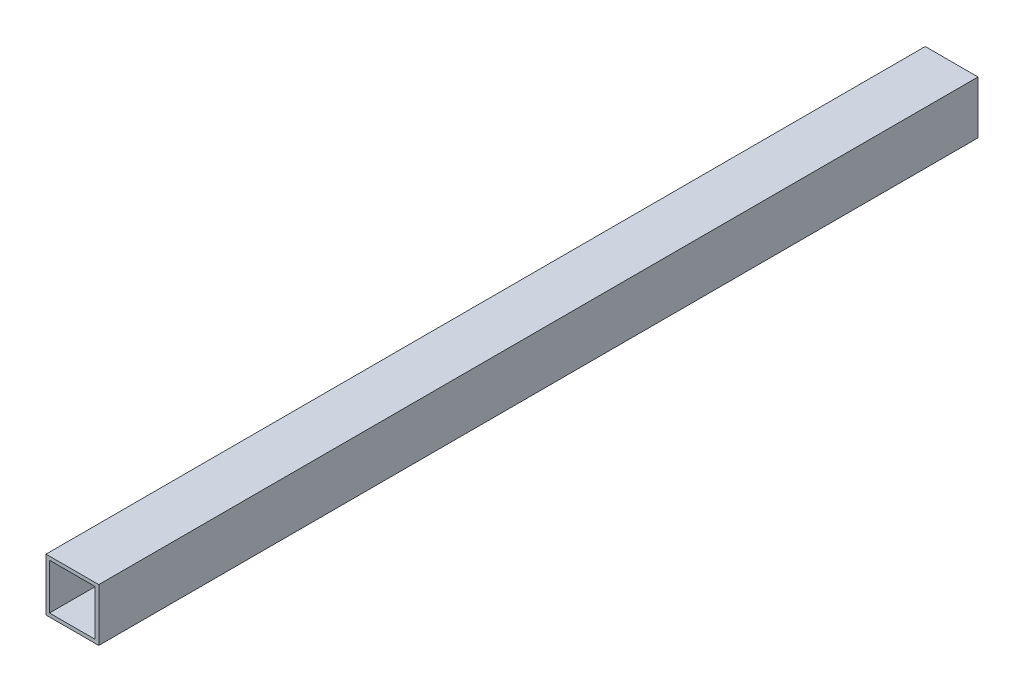
ISO-10303-21;
HEADER;
FILE_DESCRIPTION(('STEP AP214'),'2;1');
FILE_NAME('part.step','',(''),(''),'','','');
FILE_SCHEMA(('AUTOMOTIVE_DESIGN { 1 0 10303 214 1 1 1 1 }'));
ENDSEC;
DATA;
#1=APPLICATION_CONTEXT('core data for automotive mechanical design processes');
#2=APPLICATION_PROTOCOL_DEFINITION('international standard','automotive_design',2000,#1);
#3=PRODUCT_CONTEXT('',#1,'mechanical');
#4=PRODUCT('Part','Part','',(#3));
#5=PRODUCT_RELATED_PRODUCT_CATEGORY('part','',(#4));
#6=PRODUCT_DEFINITION_FORMATION('','',#4);
#7=PRODUCT_DEFINITION_CONTEXT('part definition',#1,'design');
#8=PRODUCT_DEFINITION('design','',#6,#7);
#9=PRODUCT_DEFINITION_SHAPE('','',#8);
#10=(LENGTH_UNIT() NAMED_UNIT(*) SI_UNIT(.MILLI.,.METRE.));
#11=(NAMED_UNIT(*) PLANE_ANGLE_UNIT() SI_UNIT($,.RADIAN.));
#12=(NAMED_UNIT(*) SI_UNIT($,.STERADIAN.) SOLID_ANGLE_UNIT());
#13=UNCERTAINTY_MEASURE_WITH_UNIT(LENGTH_MEASURE(1.E-05),#10,'distance_accuracy_value','');
#14=(GEOMETRIC_REPRESENTATION_CONTEXT(3) GLOBAL_UNCERTAINTY_ASSIGNED_CONTEXT((#13)) GLOBAL_UNIT_ASSIGNED_CONTEXT((#10,
#11,#12)) REPRESENTATION_CONTEXT('',''));
#15=CARTESIAN_POINT('',(0.,0.,0.));
#16=DIRECTION('',(0.,0.,1.));
#17=DIRECTION('',(1.,0.,0.));
#18=AXIS2_PLACEMENT_3D('',#15,#16,#17);
#19=CARTESIAN_POINT('',(-94.2052139280012,59.6622468790826,500.));
#20=DIRECTION('',(1.,0.,0.));
#21=DIRECTION('',(0.,0.,-1.));
#22=AXIS2_PLACEMENT_3D('',#19,#20,#21);
#23=PLANE('',#22);
#24=DIRECTION('',(0.,-1.,0.));
#25=VECTOR('',#24,1.);
#26=CARTESIAN_POINT('',(-94.2052139280012,59.6622468790826,0.));
#27=LINE('',#26,#25);
#28=CARTESIAN_POINT('',(-94.2052139280012,59.6622468790826,0.));
#29=VERTEX_POINT('',#28);
#30=CARTESIAN_POINT('',(-94.2052139280012,29.6622468790826,0.));
#31=VERTEX_POINT('',#30);
#32=EDGE_CURVE('E143',#29,#31,#27,.T.);
#33=ORIENTED_EDGE('',*,*,#32,.T.);
#34=DIRECTION('',(0.,0.,-1.));
#35=VECTOR('',#34,1.);
#36=CARTESIAN_POINT('',(-94.2052139280012,29.6622468790826,500.));
#37=LINE('',#36,#35);
#38=CARTESIAN_POINT('',(-94.2052139280012,29.6622468790826,500.));
#39=VERTEX_POINT('',#38);
#40=EDGE_CURVE('E11',#39,#31,#37,.T.);
#41=ORIENTED_EDGE('',*,*,#40,.F.);
#42=DIRECTION('',(0.,-1.,0.));
#43=VECTOR('',#42,1.);
#44=CARTESIAN_POINT('',(-94.2052139280012,59.6622468790826,500.));
#45=LINE('',#44,#43);
#46=CARTESIAN_POINT('',(-94.2052139280012,59.6622468790826,500.));
#47=VERTEX_POINT('',#46);
#48=EDGE_CURVE('E132',#47,#39,#45,.T.);
#49=ORIENTED_EDGE('',*,*,#48,.F.);
#50=DIRECTION('',(0.,0.,-1.));
#51=VECTOR('',#50,1.);
#52=CARTESIAN_POINT('',(-94.2052139280012,59.6622468790826,500.));
#53=LINE('',#52,#51);
#54=EDGE_CURVE('E142',#47,#29,#53,.T.);
#55=ORIENTED_EDGE('',*,*,#54,.T.);
#56=EDGE_LOOP('',(#33,#41,#49,#55));
#57=FACE_BOUND('',#56,.T.);
#58=ADVANCED_FACE('F35',(#57),#23,.F.);
#59=CARTESIAN_POINT('',(-94.2052139280012,29.6622468790826,500.));
#60=DIRECTION('',(0.,1.,0.));
#61=DIRECTION('',(0.,0.,1.));
#62=AXIS2_PLACEMENT_3D('',#59,#60,#61);
#63=PLANE('',#62);
#64=DIRECTION('',(1.,0.,0.));
#65=VECTOR('',#64,1.);
#66=CARTESIAN_POINT('',(-94.2052139280012,29.6622468790826,0.));
#67=LINE('',#66,#65);
#68=CARTESIAN_POINT('',(-64.2052139280012,29.6622468790826,0.));
#69=VERTEX_POINT('',#68);
#70=EDGE_CURVE('E146',#31,#69,#67,.T.);
#71=ORIENTED_EDGE('',*,*,#70,.T.);
#72=DIRECTION('',(0.,0.,-1.));
#73=VECTOR('',#72,1.);
#74=CARTESIAN_POINT('',(-64.2052139280012,29.6622468790826,500.));
#75=LINE('',#74,#73);
#76=CARTESIAN_POINT('',(-64.2052139280012,29.6622468790826,500.));
#77=VERTEX_POINT('',#76);
#78=EDGE_CURVE('E42',#77,#69,#75,.T.);
#79=ORIENTED_EDGE('',*,*,#78,.F.);
#80=DIRECTION('',(1.,0.,0.));
#81=VECTOR('',#80,1.);
#82=CARTESIAN_POINT('',(-94.2052139280012,29.6622468790826,500.));
#83=LINE('',#82,#81);
#84=EDGE_CURVE('E135',#39,#77,#83,.T.);
#85=ORIENTED_EDGE('',*,*,#84,.F.);
#86=ORIENTED_EDGE('',*,*,#40,.T.);
#87=EDGE_LOOP('',(#71,#79,#85,#86));
#88=FACE_BOUND('',#87,.T.);
#89=ADVANCED_FACE('F174',(#88),#63,.F.);
#90=CARTESIAN_POINT('',(-64.2052139280012,59.6622468790826,500.));
#91=DIRECTION('',(-1.,0.,0.));
#92=DIRECTION('',(0.,0.,1.));
#93=AXIS2_PLACEMENT_3D('',#90,#91,#92);
#94=PLANE('',#93);
#95=DIRECTION('',(0.,1.,0.));
#96=VECTOR('',#95,1.);
#97=CARTESIAN_POINT('',(-64.2052139280012,59.6622468790826,0.));
#98=LINE('',#97,#96);
#99=CARTESIAN_POINT('',(-64.2052139280012,59.6622468790826,0.));
#100=VERTEX_POINT('',#99);
#101=EDGE_CURVE('E148',#69,#100,#98,.T.);
#102=ORIENTED_EDGE('',*,*,#101,.T.);
#103=DIRECTION('',(0.,0.,-1.));
#104=VECTOR('',#103,1.);
#105=CARTESIAN_POINT('',(-64.2052139280012,59.6622468790826,500.));
#106=LINE('',#105,#104);
#107=CARTESIAN_POINT('',(-64.2052139280012,59.6622468790826,500.));
#108=VERTEX_POINT('',#107);
#109=EDGE_CURVE('E153',#108,#100,#106,.T.);
#110=ORIENTED_EDGE('',*,*,#109,.F.);
#111=DIRECTION('',(0.,1.,0.));
#112=VECTOR('',#111,1.);
#113=CARTESIAN_POINT('',(-64.2052139280012,59.6622468790826,500.));
#114=LINE('',#113,#112);
#115=EDGE_CURVE('E138',#77,#108,#114,.T.);
#116=ORIENTED_EDGE('',*,*,#115,.F.);
#117=ORIENTED_EDGE('',*,*,#78,.T.);
#118=EDGE_LOOP('',(#102,#110,#116,#117));
#119=FACE_BOUND('',#118,.T.);
#120=ADVANCED_FACE('F160',(#119),#94,.F.);
#121=CARTESIAN_POINT('',(-94.2052139280012,59.6622468790826,500.));
#122=DIRECTION('',(0.,-1.,0.));
#123=DIRECTION('',(0.,0.,-1.));
#124=AXIS2_PLACEMENT_3D('',#121,#122,#123);
#125=PLANE('',#124);
#126=DIRECTION('',(-1.,0.,0.));
#127=VECTOR('',#126,1.);
#128=CARTESIAN_POINT('',(-94.2052139280012,59.6622468790826,0.));
#129=LINE('',#128,#127);
#130=EDGE_CURVE('E136',#100,#29,#129,.T.);
#131=ORIENTED_EDGE('',*,*,#130,.T.);
#132=ORIENTED_EDGE('',*,*,#54,.F.);
#133=DIRECTION('',(-1.,0.,0.));
#134=VECTOR('',#133,1.);
#135=CARTESIAN_POINT('',(-94.2052139280012,59.6622468790826,500.));
#136=LINE('',#135,#134);
#137=EDGE_CURVE('E140',#108,#47,#136,.T.);
#138=ORIENTED_EDGE('',*,*,#137,.F.);
#139=ORIENTED_EDGE('',*,*,#109,.T.);
#140=EDGE_LOOP('',(#131,#132,#138,#139));
#141=FACE_BOUND('',#140,.T.);
#142=ADVANCED_FACE('F167',(#141),#125,.F.);
#143=CARTESIAN_POINT('',(0.,0.,500.));
#144=DIRECTION('',(0.,0.,1.));
#145=DIRECTION('',(1.,0.,0.));
#146=AXIS2_PLACEMENT_3D('',#143,#144,#145);
#147=PLANE('',#146);
#148=DIRECTION('',(0.,-1.,0.));
#149=VECTOR('',#148,1.);
#150=CARTESIAN_POINT('',(-92.2052139280012,59.6622468790826,500.));
#151=LINE('',#150,#149);
#152=CARTESIAN_POINT('',(-92.2052139280012,57.6622468790826,500.));
#153=VERTEX_POINT('',#152);
#154=CARTESIAN_POINT('',(-92.2052139280012,31.6622468790826,500.));
#155=VERTEX_POINT('',#154);
#156=EDGE_CURVE('E120',#153,#155,#151,.T.);
#157=ORIENTED_EDGE('',*,*,#156,.F.);
#158=DIRECTION('',(-1.,0.,0.));
#159=VECTOR('',#158,1.);
#160=CARTESIAN_POINT('',(-94.2052139280012,57.6622468790826,500.));
#161=LINE('',#160,#159);
#162=CARTESIAN_POINT('',(-66.2052139280012,57.6622468790826,500.));
#163=VERTEX_POINT('',#162);
#164=EDGE_CURVE('E104',#163,#153,#161,.T.);
#165=ORIENTED_EDGE('',*,*,#164,.F.);
#166=DIRECTION('',(0.,1.,0.));
#167=VECTOR('',#166,1.);
#168=CARTESIAN_POINT('',(-66.2052139280012,59.6622468790826,500.));
#169=LINE('',#168,#167);
#170=CARTESIAN_POINT('',(-66.2052139280012,31.6622468790826,500.));
#171=VERTEX_POINT('',#170);
#172=EDGE_CURVE('E129',#171,#163,#169,.T.);
#173=ORIENTED_EDGE('',*,*,#172,.F.);
#174=DIRECTION('',(1.,0.,0.));
#175=VECTOR('',#174,1.);
#176=CARTESIAN_POINT('',(-94.2052139280012,31.6622468790826,500.));
#177=LINE('',#176,#175);
#178=EDGE_CURVE('E122',#155,#171,#177,.T.);
#179=ORIENTED_EDGE('',*,*,#178,.F.);
#180=EDGE_LOOP('',(#157,#165,#173,#179));
#181=FACE_BOUND('',#180,.T.);
#182=ORIENTED_EDGE('',*,*,#48,.T.);
#183=ORIENTED_EDGE('',*,*,#84,.T.);
#184=ORIENTED_EDGE('',*,*,#115,.T.);
#185=ORIENTED_EDGE('',*,*,#137,.T.);
#186=EDGE_LOOP('',(#182,#183,#184,#185));
#187=FACE_BOUND('',#186,.T.);
#188=ADVANCED_FACE('F173',(#181,#187),#147,.T.);
#189=CARTESIAN_POINT('',(0.,0.,0.));
#190=DIRECTION('',(0.,0.,1.));
#191=DIRECTION('',(1.,0.,0.));
#192=AXIS2_PLACEMENT_3D('',#189,#190,#191);
#193=PLANE('',#192);
#194=DIRECTION('',(-1.,0.,0.));
#195=VECTOR('',#194,1.);
#196=CARTESIAN_POINT('',(-94.2052139280012,57.6622468790826,0.));
#197=LINE('',#196,#195);
#198=CARTESIAN_POINT('',(-66.2052139280012,57.6622468790826,0.));
#199=VERTEX_POINT('',#198);
#200=CARTESIAN_POINT('',(-92.2052139280012,57.6622468790826,0.));
#201=VERTEX_POINT('',#200);
#202=EDGE_CURVE('E102',#199,#201,#197,.T.);
#203=ORIENTED_EDGE('',*,*,#202,.T.);
#204=DIRECTION('',(0.,-1.,0.));
#205=VECTOR('',#204,1.);
#206=CARTESIAN_POINT('',(-92.2052139280012,59.6622468790826,0.));
#207=LINE('',#206,#205);
#208=CARTESIAN_POINT('',(-92.2052139280012,31.6622468790826,0.));
#209=VERTEX_POINT('',#208);
#210=EDGE_CURVE('E110',#201,#209,#207,.T.);
#211=ORIENTED_EDGE('',*,*,#210,.T.);
#212=DIRECTION('',(1.,0.,0.));
#213=VECTOR('',#212,1.);
#214=CARTESIAN_POINT('',(-94.2052139280012,31.6622468790826,0.));
#215=LINE('',#214,#213);
#216=CARTESIAN_POINT('',(-66.2052139280012,31.6622468790826,0.));
#217=VERTEX_POINT('',#216);
#218=EDGE_CURVE('E116',#209,#217,#215,.T.);
#219=ORIENTED_EDGE('',*,*,#218,.T.);
#220=DIRECTION('',(0.,1.,0.));
#221=VECTOR('',#220,1.);
#222=CARTESIAN_POINT('',(-66.2052139280012,59.6622468790826,0.));
#223=LINE('',#222,#221);
#224=EDGE_CURVE('E56',#217,#199,#223,.T.);
#225=ORIENTED_EDGE('',*,*,#224,.T.);
#226=EDGE_LOOP('',(#203,#211,#219,#225));
#227=FACE_BOUND('',#226,.T.);
#228=ORIENTED_EDGE('',*,*,#32,.F.);
#229=ORIENTED_EDGE('',*,*,#130,.F.);
#230=ORIENTED_EDGE('',*,*,#101,.F.);
#231=ORIENTED_EDGE('',*,*,#70,.F.);
#232=EDGE_LOOP('',(#228,#229,#230,#231));
#233=FACE_BOUND('',#232,.T.);
#234=ADVANCED_FACE('F118',(#227,#233),#193,.F.);
#235=CARTESIAN_POINT('',(-92.2052139280012,59.6622468790826,500.));
#236=DIRECTION('',(1.,0.,0.));
#237=DIRECTION('',(0.,0.,-1.));
#238=AXIS2_PLACEMENT_3D('',#235,#236,#237);
#239=PLANE('',#238);
#240=ORIENTED_EDGE('',*,*,#210,.F.);
#241=DIRECTION('',(0.,0.,-1.));
#242=VECTOR('',#241,1.);
#243=CARTESIAN_POINT('',(-92.2052139280012,57.6622468790826,500.));
#244=LINE('',#243,#242);
#245=EDGE_CURVE('E98',#153,#201,#244,.T.);
#246=ORIENTED_EDGE('',*,*,#245,.F.);
#247=ORIENTED_EDGE('',*,*,#156,.T.);
#248=DIRECTION('',(0.,0.,-1.));
#249=VECTOR('',#248,1.);
#250=CARTESIAN_POINT('',(-92.2052139280012,31.6622468790826,500.));
#251=LINE('',#250,#249);
#252=EDGE_CURVE('E113',#155,#209,#251,.T.);
#253=ORIENTED_EDGE('',*,*,#252,.T.);
#254=EDGE_LOOP('',(#240,#246,#247,#253));
#255=FACE_BOUND('',#254,.T.);
#256=ADVANCED_FACE('F111',(#255),#239,.T.);
#257=CARTESIAN_POINT('',(-94.2052139280012,31.6622468790826,500.));
#258=DIRECTION('',(0.,1.,0.));
#259=DIRECTION('',(0.,0.,1.));
#260=AXIS2_PLACEMENT_3D('',#257,#258,#259);
#261=PLANE('',#260);
#262=ORIENTED_EDGE('',*,*,#218,.F.);
#263=ORIENTED_EDGE('',*,*,#252,.F.);
#264=ORIENTED_EDGE('',*,*,#178,.T.);
#265=DIRECTION('',(0.,0.,-1.));
#266=VECTOR('',#265,1.);
#267=CARTESIAN_POINT('',(-66.2052139280012,31.6622468790826,500.));
#268=LINE('',#267,#266);
#269=EDGE_CURVE('E258',#171,#217,#268,.T.);
#270=ORIENTED_EDGE('',*,*,#269,.T.);
#271=EDGE_LOOP('',(#262,#263,#264,#270));
#272=FACE_BOUND('',#271,.T.);
#273=ADVANCED_FACE('F194',(#272),#261,.T.);
#274=CARTESIAN_POINT('',(-66.2052139280012,59.6622468790826,500.));
#275=DIRECTION('',(-1.,0.,0.));
#276=DIRECTION('',(0.,0.,1.));
#277=AXIS2_PLACEMENT_3D('',#274,#275,#276);
#278=PLANE('',#277);
#279=ORIENTED_EDGE('',*,*,#224,.F.);
#280=ORIENTED_EDGE('',*,*,#269,.F.);
#281=ORIENTED_EDGE('',*,*,#172,.T.);
#282=DIRECTION('',(0.,0.,-1.));
#283=VECTOR('',#282,1.);
#284=CARTESIAN_POINT('',(-66.2052139280012,57.6622468790826,500.));
#285=LINE('',#284,#283);
#286=EDGE_CURVE('E49',#163,#199,#285,.T.);
#287=ORIENTED_EDGE('',*,*,#286,.T.);
#288=EDGE_LOOP('',(#279,#280,#281,#287));
#289=FACE_BOUND('',#288,.T.);
#290=ADVANCED_FACE('F191',(#289),#278,.T.);
#291=CARTESIAN_POINT('',(-94.2052139280012,57.6622468790826,500.));
#292=DIRECTION('',(0.,-1.,0.));
#293=DIRECTION('',(0.,0.,-1.));
#294=AXIS2_PLACEMENT_3D('',#291,#292,#293);
#295=PLANE('',#294);
#296=ORIENTED_EDGE('',*,*,#202,.F.);
#297=ORIENTED_EDGE('',*,*,#286,.F.);
#298=ORIENTED_EDGE('',*,*,#164,.T.);
#299=ORIENTED_EDGE('',*,*,#245,.T.);
#300=EDGE_LOOP('',(#296,#297,#298,#299));
#301=FACE_BOUND('',#300,.T.);
#302=ADVANCED_FACE('F100',(#301),#295,.T.);
#303=CLOSED_SHELL('',(#58,#89,#120,#142,#188,#234,#256,#273,#290,#302));
#304=MANIFOLD_SOLID_BREP('B2',#303);
#305=ADVANCED_BREP_SHAPE_REPRESENTATION('',(#18,#304),#14);
#306=SHAPE_DEFINITION_REPRESENTATION(#9,#305);
ENDSEC;
END-ISO-10303-21;
